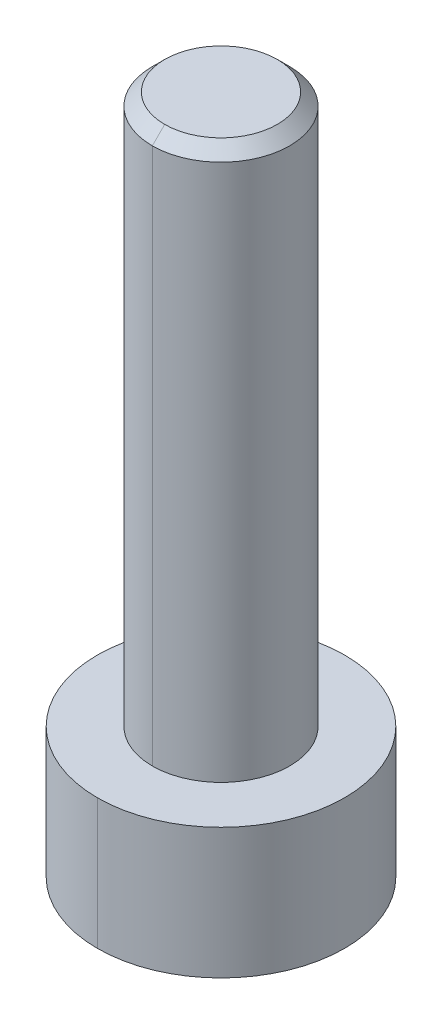
ISO-10303-21;
HEADER;
FILE_DESCRIPTION(('STEP AP214'),'2;1');
FILE_NAME('part.step','',(''),(''),'','','');
FILE_SCHEMA(('AUTOMOTIVE_DESIGN { 1 0 10303 214 1 1 1 1 }'));
ENDSEC;
DATA;
#1=APPLICATION_CONTEXT('core data for automotive mechanical design processes');
#2=APPLICATION_PROTOCOL_DEFINITION('international standard','automotive_design',2000,#1);
#3=PRODUCT_CONTEXT('',#1,'mechanical');
#4=PRODUCT('Part','Part','',(#3));
#5=PRODUCT_RELATED_PRODUCT_CATEGORY('part','',(#4));
#6=PRODUCT_DEFINITION_FORMATION('','',#4);
#7=PRODUCT_DEFINITION_CONTEXT('part definition',#1,'design');
#8=PRODUCT_DEFINITION('design','',#6,#7);
#9=PRODUCT_DEFINITION_SHAPE('','',#8);
#10=(LENGTH_UNIT() NAMED_UNIT(*) SI_UNIT(.MILLI.,.METRE.));
#11=(NAMED_UNIT(*) PLANE_ANGLE_UNIT() SI_UNIT($,.RADIAN.));
#12=(NAMED_UNIT(*) SI_UNIT($,.STERADIAN.) SOLID_ANGLE_UNIT());
#13=UNCERTAINTY_MEASURE_WITH_UNIT(LENGTH_MEASURE(1.E-05),#10,'distance_accuracy_value','');
#14=(GEOMETRIC_REPRESENTATION_CONTEXT(3) GLOBAL_UNCERTAINTY_ASSIGNED_CONTEXT((#13)) GLOBAL_UNIT_ASSIGNED_CONTEXT((#10,
#11,#12)) REPRESENTATION_CONTEXT('',''));
#15=CARTESIAN_POINT('',(0.,0.,0.));
#16=DIRECTION('',(0.,0.,1.));
#17=DIRECTION('',(1.,0.,0.));
#18=AXIS2_PLACEMENT_3D('',#15,#16,#17);
#19=CARTESIAN_POINT('',(0.,-1.25,0.));
#20=DIRECTION('',(0.,-1.,0.));
#21=DIRECTION('',(0.,0.,-1.));
#22=AXIS2_PLACEMENT_3D('',#19,#20,#21);
#23=PLANE('',#22);
#24=DIRECTION('',(-0.866025403784429,0.,0.500000000000017));
#25=VECTOR('',#24,1.);
#26=CARTESIAN_POINT('',(1.,-1.25,0.5773502691896));
#27=LINE('',#26,#25);
#28=CARTESIAN_POINT('',(1.,-1.25,0.5773502691896));
#29=VERTEX_POINT('',#28);
#30=CARTESIAN_POINT('',(0.,-1.25,1.15470053837905));
#31=VERTEX_POINT('',#30);
#32=EDGE_CURVE('E154',#29,#31,#27,.T.);
#33=ORIENTED_EDGE('',*,*,#32,.T.);
#34=DIRECTION('',(-0.866025403784429,0.,-0.500000000000017));
#35=VECTOR('',#34,1.);
#36=CARTESIAN_POINT('',(0.,-1.25,1.154700538379));
#37=LINE('',#36,#35);
#38=CARTESIAN_POINT('',(-0.999999999999945,-1.25,0.577350269189506));
#39=VERTEX_POINT('',#38);
#40=EDGE_CURVE('E11',#31,#39,#37,.T.);
#41=ORIENTED_EDGE('',*,*,#40,.T.);
#42=DIRECTION('',(0.,0.,-1.));
#43=VECTOR('',#42,1.);
#44=CARTESIAN_POINT('',(-1.,-1.25,0.5773502691896));
#45=LINE('',#44,#43);
#46=CARTESIAN_POINT('',(-1.,-1.25,-0.5773502691896));
#47=VERTEX_POINT('',#46);
#48=EDGE_CURVE('E207',#39,#47,#45,.T.);
#49=ORIENTED_EDGE('',*,*,#48,.T.);
#50=DIRECTION('',(0.866025403784429,0.,-0.500000000000017));
#51=VECTOR('',#50,1.);
#52=CARTESIAN_POINT('',(-1.,-1.25,-0.5773502691896));
#53=LINE('',#52,#51);
#54=CARTESIAN_POINT('',(0.,-1.25,-1.15470053837909));
#55=VERTEX_POINT('',#54);
#56=EDGE_CURVE('E218',#47,#55,#53,.T.);
#57=ORIENTED_EDGE('',*,*,#56,.T.);
#58=DIRECTION('',(0.866025403784429,0.,0.500000000000017));
#59=VECTOR('',#58,1.);
#60=CARTESIAN_POINT('',(0.,-1.25,-1.154700538379));
#61=LINE('',#60,#59);
#62=CARTESIAN_POINT('',(0.999999999999945,-1.25,-0.577350269189506));
#63=VERTEX_POINT('',#62);
#64=EDGE_CURVE('E136',#55,#63,#61,.T.);
#65=ORIENTED_EDGE('',*,*,#64,.T.);
#66=DIRECTION('',(0.,0.,1.));
#67=VECTOR('',#66,1.);
#68=CARTESIAN_POINT('',(1.,-1.25,-0.5773502691896));
#69=LINE('',#68,#67);
#70=EDGE_CURVE('E148',#63,#29,#69,.T.);
#71=ORIENTED_EDGE('',*,*,#70,.T.);
#72=EDGE_LOOP('',(#33,#41,#49,#57,#65,#71));
#73=FACE_BOUND('',#72,.T.);
#74=ADVANCED_FACE('F16',(#73),#23,.T.);
#75=CARTESIAN_POINT('',(0.,-2.5,1.154700538379));
#76=DIRECTION('',(-0.500000000000017,0.,0.866025403784429));
#77=DIRECTION('',(0.,1.,0.));
#78=AXIS2_PLACEMENT_3D('',#75,#76,#77);
#79=PLANE('',#78);
#80=ORIENTED_EDGE('',*,*,#40,.F.);
#81=DIRECTION('',(0.,-1.,0.));
#82=VECTOR('',#81,1.);
#83=CARTESIAN_POINT('',(1.08853898117545E-13,-2.5,1.15470053837919));
#84=LINE('',#83,#82);
#85=CARTESIAN_POINT('',(0.,-2.5,1.15470053837905));
#86=VERTEX_POINT('',#85);
#87=EDGE_CURVE('E153',#31,#86,#84,.T.);
#88=ORIENTED_EDGE('',*,*,#87,.T.);
#89=DIRECTION('',(-0.866025403784523,0.,-0.499999999999853));
#90=VECTOR('',#89,1.);
#91=CARTESIAN_POINT('',(0.,-2.5,1.154700538379));
#92=LINE('',#91,#90);
#93=CARTESIAN_POINT('',(-0.999999999999945,-2.5,0.577350269189506));
#94=VERTEX_POINT('',#93);
#95=EDGE_CURVE('E165',#86,#94,#92,.T.);
#96=ORIENTED_EDGE('',*,*,#95,.T.);
#97=DIRECTION('',(0.,1.,0.));
#98=VECTOR('',#97,1.);
#99=CARTESIAN_POINT('',(-1.,-2.5,0.5773502691896));
#100=LINE('',#99,#98);
#101=EDGE_CURVE('E27',#94,#39,#100,.T.);
#102=ORIENTED_EDGE('',*,*,#101,.T.);
#103=EDGE_LOOP('',(#80,#88,#96,#102));
#104=FACE_BOUND('',#103,.T.);
#105=ADVANCED_FACE('F18',(#104),#79,.F.);
#106=CARTESIAN_POINT('',(-1.,-2.5,0.5773502691896));
#107=DIRECTION('',(-1.,0.,0.));
#108=DIRECTION('',(0.,0.,1.));
#109=AXIS2_PLACEMENT_3D('',#106,#107,#108);
#110=PLANE('',#109);
#111=ORIENTED_EDGE('',*,*,#48,.F.);
#112=ORIENTED_EDGE('',*,*,#101,.F.);
#113=DIRECTION('',(0.,0.,-1.));
#114=VECTOR('',#113,1.);
#115=CARTESIAN_POINT('',(-1.,-2.5,0.));
#116=LINE('',#115,#114);
#117=CARTESIAN_POINT('',(-1.,-2.5,-0.5773502691896));
#118=VERTEX_POINT('',#117);
#119=EDGE_CURVE('E170',#94,#118,#116,.T.);
#120=ORIENTED_EDGE('',*,*,#119,.T.);
#121=DIRECTION('',(0.,1.,0.));
#122=VECTOR('',#121,1.);
#123=CARTESIAN_POINT('',(-1.,-2.5,-0.5773502691896));
#124=LINE('',#123,#122);
#125=EDGE_CURVE('E210',#118,#47,#124,.T.);
#126=ORIENTED_EDGE('',*,*,#125,.T.);
#127=EDGE_LOOP('',(#111,#112,#120,#126));
#128=FACE_BOUND('',#127,.T.);
#129=ADVANCED_FACE('F308',(#128),#110,.F.);
#130=CARTESIAN_POINT('',(-1.,-2.5,-0.5773502691896));
#131=DIRECTION('',(-0.500000000000017,0.,-0.866025403784429));
#132=DIRECTION('',(-0.866025403784429,0.,0.500000000000017));
#133=AXIS2_PLACEMENT_3D('',#130,#131,#132);
#134=PLANE('',#133);
#135=ORIENTED_EDGE('',*,*,#56,.F.);
#136=ORIENTED_EDGE('',*,*,#125,.F.);
#137=DIRECTION('',(0.866025403784523,0.,-0.499999999999853));
#138=VECTOR('',#137,1.);
#139=CARTESIAN_POINT('',(-1.,-2.5,-0.5773502691896));
#140=LINE('',#139,#138);
#141=CARTESIAN_POINT('',(0.,-2.5,-1.15470053837909));
#142=VERTEX_POINT('',#141);
#143=EDGE_CURVE('E20',#118,#142,#140,.T.);
#144=ORIENTED_EDGE('',*,*,#143,.T.);
#145=DIRECTION('',(0.,1.,0.));
#146=VECTOR('',#145,1.);
#147=CARTESIAN_POINT('',(0.,-2.5,-1.154700538379));
#148=LINE('',#147,#146);
#149=EDGE_CURVE('E134',#142,#55,#148,.T.);
#150=ORIENTED_EDGE('',*,*,#149,.T.);
#151=EDGE_LOOP('',(#135,#136,#144,#150));
#152=FACE_BOUND('',#151,.T.);
#153=ADVANCED_FACE('F326',(#152),#134,.F.);
#154=CARTESIAN_POINT('',(0.,-2.5,-1.154700538379));
#155=DIRECTION('',(0.500000000000017,0.,-0.866025403784429));
#156=DIRECTION('',(0.,-1.,0.));
#157=AXIS2_PLACEMENT_3D('',#154,#155,#156);
#158=PLANE('',#157);
#159=ORIENTED_EDGE('',*,*,#64,.F.);
#160=ORIENTED_EDGE('',*,*,#149,.F.);
#161=DIRECTION('',(0.866025403784523,0.,0.499999999999853));
#162=VECTOR('',#161,1.);
#163=CARTESIAN_POINT('',(0.,-2.5,-1.154700538379));
#164=LINE('',#163,#162);
#165=CARTESIAN_POINT('',(0.999999999999945,-2.5,-0.577350269189506));
#166=VERTEX_POINT('',#165);
#167=EDGE_CURVE('E223',#142,#166,#164,.T.);
#168=ORIENTED_EDGE('',*,*,#167,.T.);
#169=DIRECTION('',(0.,1.,0.));
#170=VECTOR('',#169,1.);
#171=CARTESIAN_POINT('',(1.,-2.5,-0.5773502691896));
#172=LINE('',#171,#170);
#173=EDGE_CURVE('E138',#166,#63,#172,.T.);
#174=ORIENTED_EDGE('',*,*,#173,.T.);
#175=EDGE_LOOP('',(#159,#160,#168,#174));
#176=FACE_BOUND('',#175,.T.);
#177=ADVANCED_FACE('F323',(#176),#158,.F.);
#178=CARTESIAN_POINT('',(1.,-2.5,-0.5773502691896));
#179=DIRECTION('',(1.,0.,0.));
#180=DIRECTION('',(0.,1.,0.));
#181=AXIS2_PLACEMENT_3D('',#178,#179,#180);
#182=PLANE('',#181);
#183=ORIENTED_EDGE('',*,*,#70,.F.);
#184=ORIENTED_EDGE('',*,*,#173,.F.);
#185=DIRECTION('',(0.,0.,1.));
#186=VECTOR('',#185,1.);
#187=CARTESIAN_POINT('',(1.,-2.5,0.));
#188=LINE('',#187,#186);
#189=CARTESIAN_POINT('',(1.,-2.5,0.5773502691896));
#190=VERTEX_POINT('',#189);
#191=EDGE_CURVE('E194',#166,#190,#188,.T.);
#192=ORIENTED_EDGE('',*,*,#191,.T.);
#193=DIRECTION('',(0.,1.,0.));
#194=VECTOR('',#193,1.);
#195=CARTESIAN_POINT('',(1.,-2.5,0.5773502691896));
#196=LINE('',#195,#194);
#197=EDGE_CURVE('E149',#190,#29,#196,.T.);
#198=ORIENTED_EDGE('',*,*,#197,.T.);
#199=EDGE_LOOP('',(#183,#184,#192,#198));
#200=FACE_BOUND('',#199,.T.);
#201=ADVANCED_FACE('F320',(#200),#182,.F.);
#202=CARTESIAN_POINT('',(1.,-2.5,0.5773502691896));
#203=DIRECTION('',(0.500000000000017,0.,0.866025403784429));
#204=DIRECTION('',(0.,-1.,0.));
#205=AXIS2_PLACEMENT_3D('',#202,#203,#204);
#206=PLANE('',#205);
#207=ORIENTED_EDGE('',*,*,#32,.F.);
#208=ORIENTED_EDGE('',*,*,#197,.F.);
#209=DIRECTION('',(-0.866025403784523,0.,0.499999999999853));
#210=VECTOR('',#209,1.);
#211=CARTESIAN_POINT('',(1.,-2.5,0.5773502691896));
#212=LINE('',#211,#210);
#213=EDGE_CURVE('E169',#190,#86,#212,.T.);
#214=ORIENTED_EDGE('',*,*,#213,.T.);
#215=ORIENTED_EDGE('',*,*,#87,.F.);
#216=EDGE_LOOP('',(#207,#208,#214,#215));
#217=FACE_BOUND('',#216,.T.);
#218=ADVANCED_FACE('F235',(#217),#206,.F.);
#219=CARTESIAN_POINT('',(0.,-2.5,0.));
#220=DIRECTION('',(0.,1.,0.));
#221=DIRECTION('',(1.,0.,0.));
#222=AXIS2_PLACEMENT_3D('',#219,#220,#221);
#223=PLANE('',#222);
#224=ORIENTED_EDGE('',*,*,#191,.F.);
#225=ORIENTED_EDGE('',*,*,#167,.F.);
#226=ORIENTED_EDGE('',*,*,#143,.F.);
#227=ORIENTED_EDGE('',*,*,#119,.F.);
#228=ORIENTED_EDGE('',*,*,#95,.F.);
#229=ORIENTED_EDGE('',*,*,#213,.F.);
#230=EDGE_LOOP('',(#224,#225,#226,#227,#228,#229));
#231=FACE_BOUND('',#230,.T.);
#232=CARTESIAN_POINT('',(0.,-2.49999999993209,0.));
#233=DIRECTION('',(0.,1.,0.));
#234=DIRECTION('',(0.,0.,1.));
#235=AXIS2_PLACEMENT_3D('',#232,#233,#234);
#236=CIRCLE('',#235,2.03349364903716);
#237=CARTESIAN_POINT('',(0.,-2.49999999993209,2.03349364903716));
#238=VERTEX_POINT('',#237);
#239=CARTESIAN_POINT('',(0.,-2.49999999993209,-2.03349364903716));
#240=VERTEX_POINT('',#239);
#241=EDGE_CURVE('E143',#238,#240,#236,.T.);
#242=ORIENTED_EDGE('',*,*,#241,.F.);
#243=CARTESIAN_POINT('',(0.,-2.49999999993209,0.));
#244=DIRECTION('',(0.,1.,0.));
#245=DIRECTION('',(0.,0.,1.));
#246=AXIS2_PLACEMENT_3D('',#243,#244,#245);
#247=CIRCLE('',#246,2.03349364903716);
#248=EDGE_CURVE('E190',#240,#238,#247,.T.);
#249=ORIENTED_EDGE('',*,*,#248,.F.);
#250=EDGE_LOOP('',(#242,#249));
#251=FACE_BOUND('',#250,.T.);
#252=ADVANCED_FACE('F241',(#231,#251),#223,.F.);
#253=CARTESIAN_POINT('',(0.,-2.37499999997226,0.));
#254=DIRECTION('',(0.,1.,0.));
#255=DIRECTION('',(0.,0.,1.));
#256=AXIS2_PLACEMENT_3D('',#253,#254,#255);
#257=CONICAL_SURFACE('',#256,2.24999999988995,1.04719755114913);
#258=DIRECTION('',(0.,0.500000000041109,-0.866025403760704));
#259=VECTOR('',#258,1.);
#260=CARTESIAN_POINT('',(0.,-2.37499999997226,-2.24999999988995));
#261=LINE('',#260,#259);
#262=CARTESIAN_POINT('',(0.,-2.37500000001,-2.24999999982459));
#263=VERTEX_POINT('',#262);
#264=EDGE_CURVE('E161',#240,#263,#261,.T.);
#265=ORIENTED_EDGE('',*,*,#264,.F.);
#266=ORIENTED_EDGE('',*,*,#248,.T.);
#267=DIRECTION('',(0.,0.500000000041109,0.866025403760704));
#268=VECTOR('',#267,1.);
#269=CARTESIAN_POINT('',(0.,-2.37499999997226,2.24999999988995));
#270=LINE('',#269,#268);
#271=CARTESIAN_POINT('',(0.,-2.37500000001,2.24999999982459));
#272=VERTEX_POINT('',#271);
#273=EDGE_CURVE('E112',#238,#272,#270,.T.);
#274=ORIENTED_EDGE('',*,*,#273,.T.);
#275=CARTESIAN_POINT('',(0.,-2.37500000001,0.));
#276=DIRECTION('',(0.,1.,0.));
#277=DIRECTION('',(0.,0.,1.));
#278=AXIS2_PLACEMENT_3D('',#275,#276,#277);
#279=CIRCLE('',#278,2.25);
#280=EDGE_CURVE('E186',#263,#272,#279,.T.);
#281=ORIENTED_EDGE('',*,*,#280,.F.);
#282=EDGE_LOOP('',(#265,#266,#274,#281));
#283=FACE_BOUND('',#282,.T.);
#284=ADVANCED_FACE('F299',(#283),#257,.T.);
#285=CARTESIAN_POINT('',(0.,-3.125,0.));
#286=DIRECTION('',(0.,1.,0.));
#287=DIRECTION('',(0.,0.,1.));
#288=AXIS2_PLACEMENT_3D('',#285,#286,#287);
#289=CYLINDRICAL_SURFACE('',#288,2.25);
#290=DIRECTION('',(0.,1.,0.));
#291=VECTOR('',#290,1.);
#292=CARTESIAN_POINT('',(0.,-3.125,-2.25));
#293=LINE('',#292,#291);
#294=CARTESIAN_POINT('',(0.,0.,-2.25));
#295=VERTEX_POINT('',#294);
#296=EDGE_CURVE('E182',#263,#295,#293,.T.);
#297=ORIENTED_EDGE('',*,*,#296,.F.);
#298=ORIENTED_EDGE('',*,*,#280,.T.);
#299=DIRECTION('',(0.,1.,0.));
#300=VECTOR('',#299,1.);
#301=CARTESIAN_POINT('',(0.,-3.125,2.25));
#302=LINE('',#301,#300);
#303=CARTESIAN_POINT('',(0.,0.,2.25));
#304=VERTEX_POINT('',#303);
#305=EDGE_CURVE('E139',#272,#304,#302,.T.);
#306=ORIENTED_EDGE('',*,*,#305,.T.);
#307=CARTESIAN_POINT('',(0.,0.,0.));
#308=DIRECTION('',(0.,1.,0.));
#309=DIRECTION('',(0.,0.,1.));
#310=AXIS2_PLACEMENT_3D('',#307,#308,#309);
#311=CIRCLE('',#310,2.25);
#312=EDGE_CURVE('E177',#295,#304,#311,.T.);
#313=ORIENTED_EDGE('',*,*,#312,.F.);
#314=EDGE_LOOP('',(#297,#298,#306,#313));
#315=FACE_BOUND('',#314,.T.);
#316=ADVANCED_FACE('F291',(#315),#289,.T.);
#317=CARTESIAN_POINT('',(0.,10.,0.));
#318=DIRECTION('',(0.,1.,0.));
#319=DIRECTION('',(1.,0.,0.));
#320=AXIS2_PLACEMENT_3D('',#317,#318,#319);
#321=PLANE('',#320);
#322=CARTESIAN_POINT('',(0.,10.0000000000477,0.));
#323=DIRECTION('',(0.,-1.,0.));
#324=DIRECTION('',(0.,0.,-1.));
#325=AXIS2_PLACEMENT_3D('',#322,#323,#324);
#326=CIRCLE('',#325,1.02500000002692);
#327=CARTESIAN_POINT('',(0.,10.0000000000477,-1.02500000002692));
#328=VERTEX_POINT('',#327);
#329=CARTESIAN_POINT('',(0.,10.0000000000477,1.02500000002692));
#330=VERTEX_POINT('',#329);
#331=EDGE_CURVE('E120',#328,#330,#326,.T.);
#332=ORIENTED_EDGE('',*,*,#331,.F.);
#333=CARTESIAN_POINT('',(0.,10.0000000000477,0.));
#334=DIRECTION('',(0.,-1.,0.));
#335=DIRECTION('',(0.,0.,-1.));
#336=AXIS2_PLACEMENT_3D('',#333,#334,#335);
#337=CIRCLE('',#336,1.02500000002692);
#338=EDGE_CURVE('E174',#330,#328,#337,.T.);
#339=ORIENTED_EDGE('',*,*,#338,.F.);
#340=EDGE_LOOP('',(#332,#339));
#341=FACE_BOUND('',#340,.T.);
#342=ADVANCED_FACE('F289',(#341),#321,.T.);
#343=CARTESIAN_POINT('',(0.,0.,0.));
#344=DIRECTION('',(0.,1.,0.));
#345=DIRECTION('',(1.,0.,0.));
#346=AXIS2_PLACEMENT_3D('',#343,#344,#345);
#347=PLANE('',#346);
#348=CARTESIAN_POINT('',(0.,0.,0.));
#349=DIRECTION('',(0.,1.,0.));
#350=DIRECTION('',(0.,0.,1.));
#351=AXIS2_PLACEMENT_3D('',#348,#349,#350);
#352=CIRCLE('',#351,1.25);
#353=CARTESIAN_POINT('',(0.,0.,1.25));
#354=VERTEX_POINT('',#353);
#355=CARTESIAN_POINT('',(0.,0.,-1.25));
#356=VERTEX_POINT('',#355);
#357=EDGE_CURVE('E116',#354,#356,#352,.T.);
#358=ORIENTED_EDGE('',*,*,#357,.F.);
#359=CARTESIAN_POINT('',(0.,0.,0.));
#360=DIRECTION('',(0.,1.,0.));
#361=DIRECTION('',(0.,0.,1.));
#362=AXIS2_PLACEMENT_3D('',#359,#360,#361);
#363=CIRCLE('',#362,1.25);
#364=EDGE_CURVE('E100',#356,#354,#363,.T.);
#365=ORIENTED_EDGE('',*,*,#364,.F.);
#366=EDGE_LOOP('',(#358,#365));
#367=FACE_BOUND('',#366,.T.);
#368=CARTESIAN_POINT('',(0.,0.,0.));
#369=DIRECTION('',(0.,1.,0.));
#370=DIRECTION('',(0.,0.,1.));
#371=AXIS2_PLACEMENT_3D('',#368,#369,#370);
#372=CIRCLE('',#371,2.25);
#373=EDGE_CURVE('E144',#304,#295,#372,.T.);
#374=ORIENTED_EDGE('',*,*,#373,.T.);
#375=ORIENTED_EDGE('',*,*,#312,.T.);
#376=EDGE_LOOP('',(#374,#375));
#377=FACE_BOUND('',#376,.T.);
#378=ADVANCED_FACE('F122',(#367,#377),#347,.T.);
#379=CARTESIAN_POINT('',(0.,9.77500000010423,0.));
#380=DIRECTION('',(0.,-1.,0.));
#381=DIRECTION('',(0.,0.,-1.));
#382=AXIS2_PLACEMENT_3D('',#379,#380,#381);
#383=CONICAL_SURFACE('',#382,1.24999999997044,0.785398163397448);
#384=DIRECTION('',(0.,-0.707106781186548,0.707106781186548));
#385=VECTOR('',#384,1.);
#386=CARTESIAN_POINT('',(0.,9.77500000010423,1.24999999997044));
#387=LINE('',#386,#385);
#388=CARTESIAN_POINT('',(0.,9.77500000001,1.25000000006467));
#389=VERTEX_POINT('',#388);
#390=EDGE_CURVE('E160',#330,#389,#387,.T.);
#391=ORIENTED_EDGE('',*,*,#390,.F.);
#392=ORIENTED_EDGE('',*,*,#338,.T.);
#393=DIRECTION('',(0.,-0.707106781186548,-0.707106781186548));
#394=VECTOR('',#393,1.);
#395=CARTESIAN_POINT('',(0.,9.77500000010423,-1.24999999997044));
#396=LINE('',#395,#394);
#397=CARTESIAN_POINT('',(0.,9.77500000001,-1.25000000006467));
#398=VERTEX_POINT('',#397);
#399=EDGE_CURVE('E155',#328,#398,#396,.T.);
#400=ORIENTED_EDGE('',*,*,#399,.T.);
#401=CARTESIAN_POINT('',(0.,9.77500000001,0.));
#402=DIRECTION('',(0.,-1.,0.));
#403=DIRECTION('',(0.,0.,1.));
#404=AXIS2_PLACEMENT_3D('',#401,#402,#403);
#405=CIRCLE('',#404,1.25);
#406=EDGE_CURVE('E111',#389,#398,#405,.T.);
#407=ORIENTED_EDGE('',*,*,#406,.F.);
#408=EDGE_LOOP('',(#391,#392,#400,#407));
#409=FACE_BOUND('',#408,.T.);
#410=ADVANCED_FACE('F286',(#409),#383,.T.);
#411=CARTESIAN_POINT('',(0.,-3.125,0.));
#412=DIRECTION('',(0.,1.,0.));
#413=DIRECTION('',(0.,0.,1.));
#414=AXIS2_PLACEMENT_3D('',#411,#412,#413);
#415=CYLINDRICAL_SURFACE('',#414,1.25);
#416=DIRECTION('',(0.,1.,0.));
#417=VECTOR('',#416,1.);
#418=CARTESIAN_POINT('',(0.,-3.125,-1.25));
#419=LINE('',#418,#417);
#420=EDGE_CURVE('E106',#356,#398,#419,.T.);
#421=ORIENTED_EDGE('',*,*,#420,.F.);
#422=ORIENTED_EDGE('',*,*,#364,.T.);
#423=DIRECTION('',(0.,1.,0.));
#424=VECTOR('',#423,1.);
#425=CARTESIAN_POINT('',(0.,-3.125,1.25));
#426=LINE('',#425,#424);
#427=EDGE_CURVE('E103',#354,#389,#426,.T.);
#428=ORIENTED_EDGE('',*,*,#427,.T.);
#429=ORIENTED_EDGE('',*,*,#406,.T.);
#430=EDGE_LOOP('',(#421,#422,#428,#429));
#431=FACE_BOUND('',#430,.T.);
#432=ADVANCED_FACE('F102',(#431),#415,.T.);
#433=CARTESIAN_POINT('',(0.,-2.37499999997226,0.));
#434=DIRECTION('',(0.,1.,0.));
#435=DIRECTION('',(0.,0.,1.));
#436=AXIS2_PLACEMENT_3D('',#433,#434,#435);
#437=CONICAL_SURFACE('',#436,2.24999999988995,1.04719755114913);
#438=ORIENTED_EDGE('',*,*,#241,.T.);
#439=ORIENTED_EDGE('',*,*,#264,.T.);
#440=CARTESIAN_POINT('',(0.,-2.37500000001,0.));
#441=DIRECTION('',(0.,1.,0.));
#442=DIRECTION('',(0.,0.,1.));
#443=AXIS2_PLACEMENT_3D('',#440,#441,#442);
#444=CIRCLE('',#443,2.25);
#445=EDGE_CURVE('E159',#272,#263,#444,.T.);
#446=ORIENTED_EDGE('',*,*,#445,.F.);
#447=ORIENTED_EDGE('',*,*,#273,.F.);
#448=EDGE_LOOP('',(#438,#439,#446,#447));
#449=FACE_BOUND('',#448,.T.);
#450=ADVANCED_FACE('F313',(#449),#437,.T.);
#451=CARTESIAN_POINT('',(0.,-3.125,0.));
#452=DIRECTION('',(0.,1.,0.));
#453=DIRECTION('',(0.,0.,1.));
#454=AXIS2_PLACEMENT_3D('',#451,#452,#453);
#455=CYLINDRICAL_SURFACE('',#454,2.25);
#456=ORIENTED_EDGE('',*,*,#445,.T.);
#457=ORIENTED_EDGE('',*,*,#296,.T.);
#458=ORIENTED_EDGE('',*,*,#373,.F.);
#459=ORIENTED_EDGE('',*,*,#305,.F.);
#460=EDGE_LOOP('',(#456,#457,#458,#459));
#461=FACE_BOUND('',#460,.T.);
#462=ADVANCED_FACE('F316',(#461),#455,.T.);
#463=CARTESIAN_POINT('',(0.,9.77500000010423,0.));
#464=DIRECTION('',(0.,-1.,0.));
#465=DIRECTION('',(0.,0.,-1.));
#466=AXIS2_PLACEMENT_3D('',#463,#464,#465);
#467=CONICAL_SURFACE('',#466,1.24999999997044,0.785398163397448);
#468=ORIENTED_EDGE('',*,*,#331,.T.);
#469=ORIENTED_EDGE('',*,*,#390,.T.);
#470=CARTESIAN_POINT('',(0.,9.77500000001,0.));
#471=DIRECTION('',(0.,-1.,0.));
#472=DIRECTION('',(0.,0.,1.));
#473=AXIS2_PLACEMENT_3D('',#470,#471,#472);
#474=CIRCLE('',#473,1.25);
#475=EDGE_CURVE('E118',#398,#389,#474,.T.);
#476=ORIENTED_EDGE('',*,*,#475,.F.);
#477=ORIENTED_EDGE('',*,*,#399,.F.);
#478=EDGE_LOOP('',(#468,#469,#476,#477));
#479=FACE_BOUND('',#478,.T.);
#480=ADVANCED_FACE('F288',(#479),#467,.T.);
#481=CARTESIAN_POINT('',(0.,-3.125,0.));
#482=DIRECTION('',(0.,1.,0.));
#483=DIRECTION('',(0.,0.,1.));
#484=AXIS2_PLACEMENT_3D('',#481,#482,#483);
#485=CYLINDRICAL_SURFACE('',#484,1.25);
#486=ORIENTED_EDGE('',*,*,#357,.T.);
#487=ORIENTED_EDGE('',*,*,#420,.T.);
#488=ORIENTED_EDGE('',*,*,#475,.T.);
#489=ORIENTED_EDGE('',*,*,#427,.F.);
#490=EDGE_LOOP('',(#486,#487,#488,#489));
#491=FACE_BOUND('',#490,.T.);
#492=ADVANCED_FACE('F115',(#491),#485,.T.);
#493=CLOSED_SHELL('',(#74,#105,#129,#153,#177,#201,#218,#252,#284,#316,#342,#378,#410,#432,#450,
#462,#480,#492));
#494=MANIFOLD_SOLID_BREP('B1',#493);
#495=ADVANCED_BREP_SHAPE_REPRESENTATION('',(#18,#494),#14);
#496=SHAPE_DEFINITION_REPRESENTATION(#9,#495);
ENDSEC;
END-ISO-10303-21;
